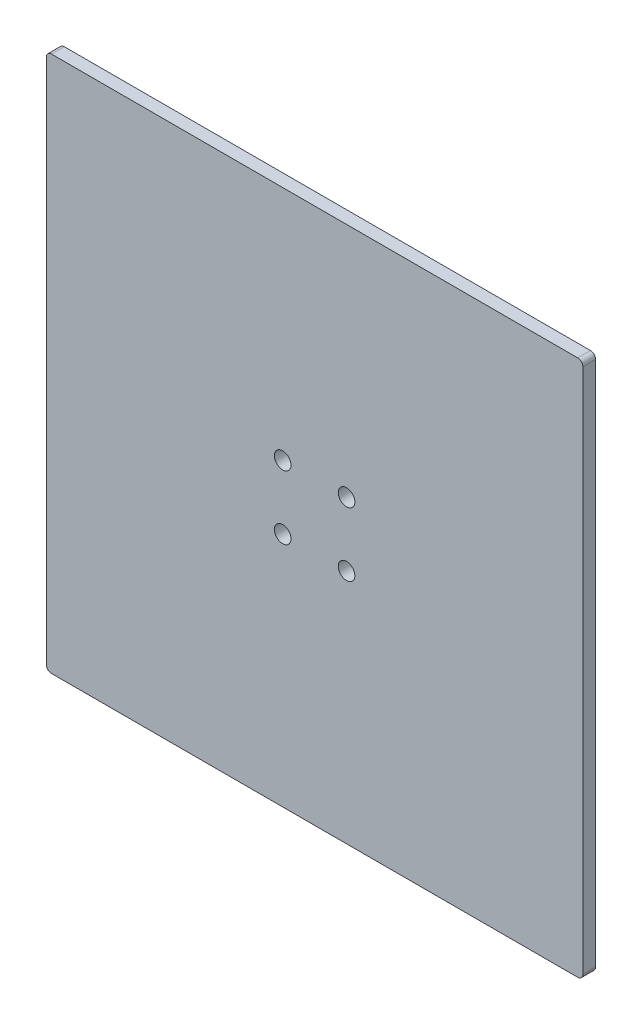
ISO-10303-21;
HEADER;
FILE_DESCRIPTION(('STEP AP214'),'2;1');
FILE_NAME('part.step','',(''),(''),'','','');
FILE_SCHEMA(('AUTOMOTIVE_DESIGN { 1 0 10303 214 1 1 1 1 }'));
ENDSEC;
DATA;
#1=APPLICATION_CONTEXT('core data for automotive mechanical design processes');
#2=APPLICATION_PROTOCOL_DEFINITION('international standard','automotive_design',2000,#1);
#3=PRODUCT_CONTEXT('',#1,'mechanical');
#4=PRODUCT('Part','Part','',(#3));
#5=PRODUCT_RELATED_PRODUCT_CATEGORY('part','',(#4));
#6=PRODUCT_DEFINITION_FORMATION('','',#4);
#7=PRODUCT_DEFINITION_CONTEXT('part definition',#1,'design');
#8=PRODUCT_DEFINITION('design','',#6,#7);
#9=PRODUCT_DEFINITION_SHAPE('','',#8);
#10=(LENGTH_UNIT() NAMED_UNIT(*) SI_UNIT(.MILLI.,.METRE.));
#11=(NAMED_UNIT(*) PLANE_ANGLE_UNIT() SI_UNIT($,.RADIAN.));
#12=(NAMED_UNIT(*) SI_UNIT($,.STERADIAN.) SOLID_ANGLE_UNIT());
#13=UNCERTAINTY_MEASURE_WITH_UNIT(LENGTH_MEASURE(1.E-05),#10,'distance_accuracy_value','');
#14=(GEOMETRIC_REPRESENTATION_CONTEXT(3) GLOBAL_UNCERTAINTY_ASSIGNED_CONTEXT((#13)) GLOBAL_UNIT_ASSIGNED_CONTEXT((#10,
#11,#12)) REPRESENTATION_CONTEXT('',''));
#15=CARTESIAN_POINT('',(0.,0.,0.));
#16=DIRECTION('',(0.,0.,1.));
#17=DIRECTION('',(1.,0.,0.));
#18=AXIS2_PLACEMENT_3D('',#15,#16,#17);
#19=CARTESIAN_POINT('',(0.,0.,5.));
#20=DIRECTION('',(0.,0.,-1.));
#21=DIRECTION('',(-1.,0.,0.));
#22=AXIS2_PLACEMENT_3D('',#19,#20,#21);
#23=PLANE('',#22);
#24=DIRECTION('',(1.,0.,0.));
#25=VECTOR('',#24,1.);
#26=CARTESIAN_POINT('',(105.,-105.,5.));
#27=LINE('',#26,#25);
#28=CARTESIAN_POINT('',(-103.,-105.,5.));
#29=VERTEX_POINT('',#28);
#30=CARTESIAN_POINT('',(103.,-105.,5.));
#31=VERTEX_POINT('',#30);
#32=EDGE_CURVE('E168',#29,#31,#27,.T.);
#33=ORIENTED_EDGE('',*,*,#32,.T.);
#34=CARTESIAN_POINT('',(103.,-103.,5.));
#35=DIRECTION('',(0.,0.,-1.));
#36=DIRECTION('',(-1.,0.,0.));
#37=AXIS2_PLACEMENT_3D('',#34,#35,#36);
#38=CIRCLE('',#37,2.);
#39=CARTESIAN_POINT('',(105.,-103.,5.));
#40=VERTEX_POINT('',#39);
#41=EDGE_CURVE('E148',#31,#40,#38,.F.);
#42=ORIENTED_EDGE('',*,*,#41,.T.);
#43=DIRECTION('',(0.,1.,0.));
#44=VECTOR('',#43,1.);
#45=CARTESIAN_POINT('',(105.,105.,5.));
#46=LINE('',#45,#44);
#47=CARTESIAN_POINT('',(105.,103.,5.));
#48=VERTEX_POINT('',#47);
#49=EDGE_CURVE('E118',#40,#48,#46,.T.);
#50=ORIENTED_EDGE('',*,*,#49,.T.);
#51=CARTESIAN_POINT('',(103.,103.,5.));
#52=DIRECTION('',(0.,0.,-1.));
#53=DIRECTION('',(-1.,0.,0.));
#54=AXIS2_PLACEMENT_3D('',#51,#52,#53);
#55=CIRCLE('',#54,2.);
#56=CARTESIAN_POINT('',(103.,105.,5.));
#57=VERTEX_POINT('',#56);
#58=EDGE_CURVE('E54',#48,#57,#55,.F.);
#59=ORIENTED_EDGE('',*,*,#58,.T.);
#60=DIRECTION('',(-1.,0.,0.));
#61=VECTOR('',#60,1.);
#62=CARTESIAN_POINT('',(105.,105.,5.));
#63=LINE('',#62,#61);
#64=CARTESIAN_POINT('',(-103.,105.,5.));
#65=VERTEX_POINT('',#64);
#66=EDGE_CURVE('E135',#57,#65,#63,.T.);
#67=ORIENTED_EDGE('',*,*,#66,.T.);
#68=CARTESIAN_POINT('',(-103.,103.,5.));
#69=DIRECTION('',(0.,0.,-1.));
#70=DIRECTION('',(-1.,0.,0.));
#71=AXIS2_PLACEMENT_3D('',#68,#69,#70);
#72=CIRCLE('',#71,2.);
#73=CARTESIAN_POINT('',(-105.,103.,5.));
#74=VERTEX_POINT('',#73);
#75=EDGE_CURVE('E143',#65,#74,#72,.F.);
#76=ORIENTED_EDGE('',*,*,#75,.T.);
#77=DIRECTION('',(0.,-1.,0.));
#78=VECTOR('',#77,1.);
#79=CARTESIAN_POINT('',(-105.,105.,5.));
#80=LINE('',#79,#78);
#81=CARTESIAN_POINT('',(-105.,-103.,5.));
#82=VERTEX_POINT('',#81);
#83=EDGE_CURVE('E129',#74,#82,#80,.T.);
#84=ORIENTED_EDGE('',*,*,#83,.T.);
#85=CARTESIAN_POINT('',(-103.,-103.,5.));
#86=DIRECTION('',(0.,0.,-1.));
#87=DIRECTION('',(-1.,0.,0.));
#88=AXIS2_PLACEMENT_3D('',#85,#86,#87);
#89=CIRCLE('',#88,2.);
#90=EDGE_CURVE('E146',#82,#29,#89,.F.);
#91=ORIENTED_EDGE('',*,*,#90,.T.);
#92=EDGE_LOOP('',(#33,#42,#50,#59,#67,#76,#84,#91));
#93=FACE_BOUND('',#92,.T.);
#94=CARTESIAN_POINT('',(-12.5,12.5,5.));
#95=DIRECTION('',(0.,0.,1.));
#96=DIRECTION('',(1.,0.,0.));
#97=AXIS2_PLACEMENT_3D('',#94,#95,#96);
#98=CIRCLE('',#97,3.25);
#99=CARTESIAN_POINT('',(-9.25000000000002,12.5,5.));
#100=VERTEX_POINT('',#99);
#101=EDGE_CURVE('E174',#100,#100,#98,.T.);
#102=ORIENTED_EDGE('',*,*,#101,.F.);
#103=EDGE_LOOP('',(#102));
#104=FACE_BOUND('',#103,.T.);
#105=CARTESIAN_POINT('',(12.5,12.5,5.));
#106=DIRECTION('',(0.,0.,1.));
#107=DIRECTION('',(1.,0.,0.));
#108=AXIS2_PLACEMENT_3D('',#105,#106,#107);
#109=CIRCLE('',#108,3.25);
#110=CARTESIAN_POINT('',(15.75,12.5,5.));
#111=VERTEX_POINT('',#110);
#112=EDGE_CURVE('E183',#111,#111,#109,.T.);
#113=ORIENTED_EDGE('',*,*,#112,.F.);
#114=EDGE_LOOP('',(#113));
#115=FACE_BOUND('',#114,.T.);
#116=CARTESIAN_POINT('',(-12.5,-12.5,5.));
#117=DIRECTION('',(0.,0.,1.));
#118=DIRECTION('',(1.,0.,0.));
#119=AXIS2_PLACEMENT_3D('',#116,#117,#118);
#120=CIRCLE('',#119,3.25);
#121=CARTESIAN_POINT('',(-9.25000000000002,-12.5,5.));
#122=VERTEX_POINT('',#121);
#123=EDGE_CURVE('E188',#122,#122,#120,.T.);
#124=ORIENTED_EDGE('',*,*,#123,.F.);
#125=EDGE_LOOP('',(#124));
#126=FACE_BOUND('',#125,.T.);
#127=CARTESIAN_POINT('',(12.5,-12.5,5.));
#128=DIRECTION('',(0.,0.,1.));
#129=DIRECTION('',(1.,0.,0.));
#130=AXIS2_PLACEMENT_3D('',#127,#128,#129);
#131=CIRCLE('',#130,3.25);
#132=CARTESIAN_POINT('',(15.75,-12.5,5.));
#133=VERTEX_POINT('',#132);
#134=EDGE_CURVE('E194',#133,#133,#131,.T.);
#135=ORIENTED_EDGE('',*,*,#134,.F.);
#136=EDGE_LOOP('',(#135));
#137=FACE_BOUND('',#136,.T.);
#138=ADVANCED_FACE('F33',(#93,#104,#115,#126,#137),#23,.F.);
#139=CARTESIAN_POINT('',(0.,0.,0.));
#140=DIRECTION('',(0.,0.,-1.));
#141=DIRECTION('',(-1.,0.,0.));
#142=AXIS2_PLACEMENT_3D('',#139,#140,#141);
#143=PLANE('',#142);
#144=CARTESIAN_POINT('',(-12.5,-12.5,0.));
#145=DIRECTION('',(0.,0.,1.));
#146=DIRECTION('',(1.,0.,0.));
#147=AXIS2_PLACEMENT_3D('',#144,#145,#146);
#148=CIRCLE('',#147,3.25);
#149=CARTESIAN_POINT('',(-9.25000000000002,-12.5,0.));
#150=VERTEX_POINT('',#149);
#151=EDGE_CURVE('E191',#150,#150,#148,.T.);
#152=ORIENTED_EDGE('',*,*,#151,.T.);
#153=EDGE_LOOP('',(#152));
#154=FACE_BOUND('',#153,.T.);
#155=CARTESIAN_POINT('',(-12.5,12.5,0.));
#156=DIRECTION('',(0.,0.,1.));
#157=DIRECTION('',(1.,0.,0.));
#158=AXIS2_PLACEMENT_3D('',#155,#156,#157);
#159=CIRCLE('',#158,3.25);
#160=CARTESIAN_POINT('',(-9.25000000000002,12.5,0.));
#161=VERTEX_POINT('',#160);
#162=EDGE_CURVE('E176',#161,#161,#159,.T.);
#163=ORIENTED_EDGE('',*,*,#162,.T.);
#164=EDGE_LOOP('',(#163));
#165=FACE_BOUND('',#164,.T.);
#166=DIRECTION('',(0.,1.,0.));
#167=VECTOR('',#166,1.);
#168=CARTESIAN_POINT('',(105.,105.,0.));
#169=LINE('',#168,#167);
#170=CARTESIAN_POINT('',(105.,-103.,0.));
#171=VERTEX_POINT('',#170);
#172=CARTESIAN_POINT('',(105.,103.,0.));
#173=VERTEX_POINT('',#172);
#174=EDGE_CURVE('E116',#171,#173,#169,.T.);
#175=ORIENTED_EDGE('',*,*,#174,.F.);
#176=CARTESIAN_POINT('',(103.,-103.,0.));
#177=DIRECTION('',(0.,0.,-1.));
#178=DIRECTION('',(-1.,0.,0.));
#179=AXIS2_PLACEMENT_3D('',#176,#177,#178);
#180=CIRCLE('',#179,2.);
#181=CARTESIAN_POINT('',(103.,-105.,0.));
#182=VERTEX_POINT('',#181);
#183=EDGE_CURVE('E99',#171,#182,#180,.T.);
#184=ORIENTED_EDGE('',*,*,#183,.T.);
#185=DIRECTION('',(1.,0.,0.));
#186=VECTOR('',#185,1.);
#187=CARTESIAN_POINT('',(105.,-105.,0.));
#188=LINE('',#187,#186);
#189=CARTESIAN_POINT('',(-103.,-105.,0.));
#190=VERTEX_POINT('',#189);
#191=EDGE_CURVE('E127',#190,#182,#188,.T.);
#192=ORIENTED_EDGE('',*,*,#191,.F.);
#193=CARTESIAN_POINT('',(-103.,-103.,0.));
#194=DIRECTION('',(0.,0.,-1.));
#195=DIRECTION('',(-1.,0.,0.));
#196=AXIS2_PLACEMENT_3D('',#193,#194,#195);
#197=CIRCLE('',#196,2.);
#198=CARTESIAN_POINT('',(-105.,-103.,0.));
#199=VERTEX_POINT('',#198);
#200=EDGE_CURVE('E110',#190,#199,#197,.T.);
#201=ORIENTED_EDGE('',*,*,#200,.T.);
#202=DIRECTION('',(0.,-1.,0.));
#203=VECTOR('',#202,1.);
#204=CARTESIAN_POINT('',(-105.,105.,0.));
#205=LINE('',#204,#203);
#206=CARTESIAN_POINT('',(-105.,103.,0.));
#207=VERTEX_POINT('',#206);
#208=EDGE_CURVE('E131',#207,#199,#205,.T.);
#209=ORIENTED_EDGE('',*,*,#208,.F.);
#210=CARTESIAN_POINT('',(-103.,103.,0.));
#211=DIRECTION('',(0.,0.,-1.));
#212=DIRECTION('',(-1.,0.,0.));
#213=AXIS2_PLACEMENT_3D('',#210,#211,#212);
#214=CIRCLE('',#213,2.);
#215=CARTESIAN_POINT('',(-103.,105.,0.));
#216=VERTEX_POINT('',#215);
#217=EDGE_CURVE('E119',#207,#216,#214,.T.);
#218=ORIENTED_EDGE('',*,*,#217,.T.);
#219=DIRECTION('',(-1.,0.,0.));
#220=VECTOR('',#219,1.);
#221=CARTESIAN_POINT('',(105.,105.,0.));
#222=LINE('',#221,#220);
#223=CARTESIAN_POINT('',(103.,105.,0.));
#224=VERTEX_POINT('',#223);
#225=EDGE_CURVE('E126',#224,#216,#222,.T.);
#226=ORIENTED_EDGE('',*,*,#225,.F.);
#227=CARTESIAN_POINT('',(103.,103.,0.));
#228=DIRECTION('',(0.,0.,-1.));
#229=DIRECTION('',(-1.,0.,0.));
#230=AXIS2_PLACEMENT_3D('',#227,#228,#229);
#231=CIRCLE('',#230,2.);
#232=EDGE_CURVE('E125',#224,#173,#231,.T.);
#233=ORIENTED_EDGE('',*,*,#232,.T.);
#234=EDGE_LOOP('',(#175,#184,#192,#201,#209,#218,#226,#233));
#235=FACE_BOUND('',#234,.T.);
#236=CARTESIAN_POINT('',(12.5,12.5,0.));
#237=DIRECTION('',(0.,0.,1.));
#238=DIRECTION('',(1.,0.,0.));
#239=AXIS2_PLACEMENT_3D('',#236,#237,#238);
#240=CIRCLE('',#239,3.25);
#241=CARTESIAN_POINT('',(15.75,12.5,0.));
#242=VERTEX_POINT('',#241);
#243=EDGE_CURVE('E185',#242,#242,#240,.T.);
#244=ORIENTED_EDGE('',*,*,#243,.T.);
#245=EDGE_LOOP('',(#244));
#246=FACE_BOUND('',#245,.T.);
#247=CARTESIAN_POINT('',(12.5,-12.5,0.));
#248=DIRECTION('',(0.,0.,1.));
#249=DIRECTION('',(1.,0.,0.));
#250=AXIS2_PLACEMENT_3D('',#247,#248,#249);
#251=CIRCLE('',#250,3.25);
#252=CARTESIAN_POINT('',(15.75,-12.5,0.));
#253=VERTEX_POINT('',#252);
#254=EDGE_CURVE('E197',#253,#253,#251,.T.);
#255=ORIENTED_EDGE('',*,*,#254,.T.);
#256=EDGE_LOOP('',(#255));
#257=FACE_BOUND('',#256,.T.);
#258=ADVANCED_FACE('F122',(#154,#165,#235,#246,#257),#143,.T.);
#259=CARTESIAN_POINT('',(-105.,105.,5.));
#260=DIRECTION('',(1.,0.,0.));
#261=DIRECTION('',(0.,1.,0.));
#262=AXIS2_PLACEMENT_3D('',#259,#260,#261);
#263=PLANE('',#262);
#264=ORIENTED_EDGE('',*,*,#208,.T.);
#265=DIRECTION('',(0.,0.,-1.));
#266=VECTOR('',#265,1.);
#267=CARTESIAN_POINT('',(-105.,-103.,5.));
#268=LINE('',#267,#266);
#269=EDGE_CURVE('E153',#199,#82,#268,.F.);
#270=ORIENTED_EDGE('',*,*,#269,.T.);
#271=ORIENTED_EDGE('',*,*,#83,.F.);
#272=DIRECTION('',(0.,0.,-1.));
#273=VECTOR('',#272,1.);
#274=CARTESIAN_POINT('',(-105.,103.,5.));
#275=LINE('',#274,#273);
#276=EDGE_CURVE('E150',#74,#207,#275,.T.);
#277=ORIENTED_EDGE('',*,*,#276,.T.);
#278=EDGE_LOOP('',(#264,#270,#271,#277));
#279=FACE_BOUND('',#278,.T.);
#280=ADVANCED_FACE('F159',(#279),#263,.F.);
#281=CARTESIAN_POINT('',(105.,-105.,5.));
#282=DIRECTION('',(0.,1.,0.));
#283=DIRECTION('',(-1.,0.,0.));
#284=AXIS2_PLACEMENT_3D('',#281,#282,#283);
#285=PLANE('',#284);
#286=ORIENTED_EDGE('',*,*,#191,.T.);
#287=DIRECTION('',(0.,0.,-1.));
#288=VECTOR('',#287,1.);
#289=CARTESIAN_POINT('',(103.,-105.,5.));
#290=LINE('',#289,#288);
#291=EDGE_CURVE('E104',#182,#31,#290,.F.);
#292=ORIENTED_EDGE('',*,*,#291,.T.);
#293=ORIENTED_EDGE('',*,*,#32,.F.);
#294=DIRECTION('',(0.,0.,-1.));
#295=VECTOR('',#294,1.);
#296=CARTESIAN_POINT('',(-103.,-105.,5.));
#297=LINE('',#296,#295);
#298=EDGE_CURVE('E109',#29,#190,#297,.T.);
#299=ORIENTED_EDGE('',*,*,#298,.T.);
#300=EDGE_LOOP('',(#286,#292,#293,#299));
#301=FACE_BOUND('',#300,.T.);
#302=ADVANCED_FACE('F173',(#301),#285,.F.);
#303=CARTESIAN_POINT('',(105.,105.,5.));
#304=DIRECTION('',(-1.,0.,0.));
#305=DIRECTION('',(0.,-1.,0.));
#306=AXIS2_PLACEMENT_3D('',#303,#304,#305);
#307=PLANE('',#306);
#308=ORIENTED_EDGE('',*,*,#49,.F.);
#309=DIRECTION('',(0.,0.,-1.));
#310=VECTOR('',#309,1.);
#311=CARTESIAN_POINT('',(105.,-103.,5.));
#312=LINE('',#311,#310);
#313=EDGE_CURVE('E103',#40,#171,#312,.T.);
#314=ORIENTED_EDGE('',*,*,#313,.T.);
#315=ORIENTED_EDGE('',*,*,#174,.T.);
#316=DIRECTION('',(0.,0.,-1.));
#317=VECTOR('',#316,1.);
#318=CARTESIAN_POINT('',(105.,103.,5.));
#319=LINE('',#318,#317);
#320=EDGE_CURVE('E120',#173,#48,#319,.F.);
#321=ORIENTED_EDGE('',*,*,#320,.T.);
#322=EDGE_LOOP('',(#308,#314,#315,#321));
#323=FACE_BOUND('',#322,.T.);
#324=ADVANCED_FACE('F115',(#323),#307,.F.);
#325=CARTESIAN_POINT('',(105.,105.,5.));
#326=DIRECTION('',(0.,-1.,0.));
#327=DIRECTION('',(1.,0.,0.));
#328=AXIS2_PLACEMENT_3D('',#325,#326,#327);
#329=PLANE('',#328);
#330=ORIENTED_EDGE('',*,*,#66,.F.);
#331=DIRECTION('',(0.,0.,-1.));
#332=VECTOR('',#331,1.);
#333=CARTESIAN_POINT('',(103.,105.,5.));
#334=LINE('',#333,#332);
#335=EDGE_CURVE('E11',#57,#224,#334,.T.);
#336=ORIENTED_EDGE('',*,*,#335,.T.);
#337=ORIENTED_EDGE('',*,*,#225,.T.);
#338=DIRECTION('',(0.,0.,-1.));
#339=VECTOR('',#338,1.);
#340=CARTESIAN_POINT('',(-103.,105.,5.));
#341=LINE('',#340,#339);
#342=EDGE_CURVE('E41',#216,#65,#341,.F.);
#343=ORIENTED_EDGE('',*,*,#342,.T.);
#344=EDGE_LOOP('',(#330,#336,#337,#343));
#345=FACE_BOUND('',#344,.T.);
#346=ADVANCED_FACE('F217',(#345),#329,.F.);
#347=CARTESIAN_POINT('',(-12.5,12.5,5.));
#348=DIRECTION('',(0.,0.,-1.));
#349=DIRECTION('',(-1.,0.,0.));
#350=AXIS2_PLACEMENT_3D('',#347,#348,#349);
#351=CYLINDRICAL_SURFACE('',#350,3.25);
#352=ORIENTED_EDGE('',*,*,#101,.T.);
#353=EDGE_LOOP('',(#352));
#354=FACE_BOUND('',#353,.T.);
#355=ORIENTED_EDGE('',*,*,#162,.F.);
#356=EDGE_LOOP('',(#355));
#357=FACE_BOUND('',#356,.T.);
#358=ADVANCED_FACE('F214',(#354,#357),#351,.F.);
#359=CARTESIAN_POINT('',(12.5,12.5,5.));
#360=DIRECTION('',(0.,0.,-1.));
#361=DIRECTION('',(-1.,0.,0.));
#362=AXIS2_PLACEMENT_3D('',#359,#360,#361);
#363=CYLINDRICAL_SURFACE('',#362,3.25);
#364=ORIENTED_EDGE('',*,*,#112,.T.);
#365=EDGE_LOOP('',(#364));
#366=FACE_BOUND('',#365,.T.);
#367=ORIENTED_EDGE('',*,*,#243,.F.);
#368=EDGE_LOOP('',(#367));
#369=FACE_BOUND('',#368,.T.);
#370=ADVANCED_FACE('F309',(#366,#369),#363,.F.);
#371=CARTESIAN_POINT('',(-12.5,-12.5,5.));
#372=DIRECTION('',(0.,0.,-1.));
#373=DIRECTION('',(-1.,0.,0.));
#374=AXIS2_PLACEMENT_3D('',#371,#372,#373);
#375=CYLINDRICAL_SURFACE('',#374,3.25);
#376=ORIENTED_EDGE('',*,*,#123,.T.);
#377=EDGE_LOOP('',(#376));
#378=FACE_BOUND('',#377,.T.);
#379=ORIENTED_EDGE('',*,*,#151,.F.);
#380=EDGE_LOOP('',(#379));
#381=FACE_BOUND('',#380,.T.);
#382=ADVANCED_FACE('F300',(#378,#381),#375,.F.);
#383=CARTESIAN_POINT('',(12.5,-12.5,5.));
#384=DIRECTION('',(0.,0.,-1.));
#385=DIRECTION('',(-1.,0.,0.));
#386=AXIS2_PLACEMENT_3D('',#383,#384,#385);
#387=CYLINDRICAL_SURFACE('',#386,3.25);
#388=ORIENTED_EDGE('',*,*,#134,.T.);
#389=EDGE_LOOP('',(#388));
#390=FACE_BOUND('',#389,.T.);
#391=ORIENTED_EDGE('',*,*,#254,.F.);
#392=EDGE_LOOP('',(#391));
#393=FACE_BOUND('',#392,.T.);
#394=ADVANCED_FACE('F203',(#390,#393),#387,.F.);
#395=CARTESIAN_POINT('',(103.,-103.,5.));
#396=DIRECTION('',(0.,0.,-1.));
#397=DIRECTION('',(-1.,0.,0.));
#398=AXIS2_PLACEMENT_3D('',#395,#396,#397);
#399=CYLINDRICAL_SURFACE('',#398,2.);
#400=ORIENTED_EDGE('',*,*,#41,.F.);
#401=ORIENTED_EDGE('',*,*,#291,.F.);
#402=ORIENTED_EDGE('',*,*,#183,.F.);
#403=ORIENTED_EDGE('',*,*,#313,.F.);
#404=EDGE_LOOP('',(#400,#401,#402,#403));
#405=FACE_BOUND('',#404,.T.);
#406=ADVANCED_FACE('F102',(#405),#399,.T.);
#407=CARTESIAN_POINT('',(-103.,-103.,5.));
#408=DIRECTION('',(0.,0.,-1.));
#409=DIRECTION('',(-1.,0.,0.));
#410=AXIS2_PLACEMENT_3D('',#407,#408,#409);
#411=CYLINDRICAL_SURFACE('',#410,2.);
#412=ORIENTED_EDGE('',*,*,#90,.F.);
#413=ORIENTED_EDGE('',*,*,#269,.F.);
#414=ORIENTED_EDGE('',*,*,#200,.F.);
#415=ORIENTED_EDGE('',*,*,#298,.F.);
#416=EDGE_LOOP('',(#412,#413,#414,#415));
#417=FACE_BOUND('',#416,.T.);
#418=ADVANCED_FACE('F171',(#417),#411,.T.);
#419=CARTESIAN_POINT('',(103.,103.,5.));
#420=DIRECTION('',(0.,0.,-1.));
#421=DIRECTION('',(-1.,0.,0.));
#422=AXIS2_PLACEMENT_3D('',#419,#420,#421);
#423=CYLINDRICAL_SURFACE('',#422,2.);
#424=ORIENTED_EDGE('',*,*,#58,.F.);
#425=ORIENTED_EDGE('',*,*,#320,.F.);
#426=ORIENTED_EDGE('',*,*,#232,.F.);
#427=ORIENTED_EDGE('',*,*,#335,.F.);
#428=EDGE_LOOP('',(#424,#425,#426,#427));
#429=FACE_BOUND('',#428,.T.);
#430=ADVANCED_FACE('F229',(#429),#423,.T.);
#431=CARTESIAN_POINT('',(-103.,103.,5.));
#432=DIRECTION('',(0.,0.,-1.));
#433=DIRECTION('',(-1.,0.,0.));
#434=AXIS2_PLACEMENT_3D('',#431,#432,#433);
#435=CYLINDRICAL_SURFACE('',#434,2.);
#436=ORIENTED_EDGE('',*,*,#75,.F.);
#437=ORIENTED_EDGE('',*,*,#342,.F.);
#438=ORIENTED_EDGE('',*,*,#217,.F.);
#439=ORIENTED_EDGE('',*,*,#276,.F.);
#440=EDGE_LOOP('',(#436,#437,#438,#439));
#441=FACE_BOUND('',#440,.T.);
#442=ADVANCED_FACE('F35',(#441),#435,.T.);
#443=CLOSED_SHELL('',(#138,#258,#280,#302,#324,#346,#358,#370,#382,#394,#406,#418,#430,#442));
#444=MANIFOLD_SOLID_BREP('B2',#443);
#445=ADVANCED_BREP_SHAPE_REPRESENTATION('',(#18,#444),#14);
#446=SHAPE_DEFINITION_REPRESENTATION(#9,#445);
ENDSEC;
END-ISO-10303-21;
